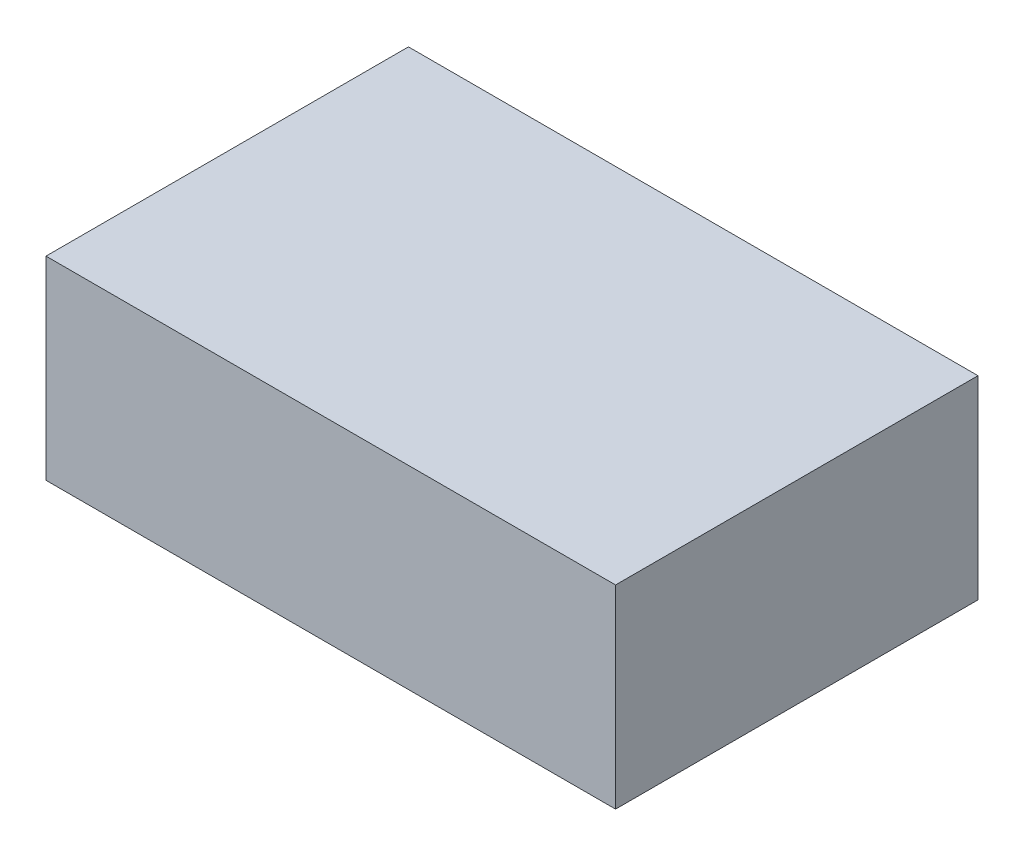
ISO-10303-21;
HEADER;
FILE_DESCRIPTION(('STEP AP214'),'2;1');
FILE_NAME('part.step','',(''),(''),'','','');
FILE_SCHEMA(('AUTOMOTIVE_DESIGN { 1 0 10303 214 1 1 1 1 }'));
ENDSEC;
DATA;
#1=APPLICATION_CONTEXT('core data for automotive mechanical design processes');
#2=APPLICATION_PROTOCOL_DEFINITION('international standard','automotive_design',2000,#1);
#3=PRODUCT_CONTEXT('',#1,'mechanical');
#4=PRODUCT('Part','Part','',(#3));
#5=PRODUCT_RELATED_PRODUCT_CATEGORY('part','',(#4));
#6=PRODUCT_DEFINITION_FORMATION('','',#4);
#7=PRODUCT_DEFINITION_CONTEXT('part definition',#1,'design');
#8=PRODUCT_DEFINITION('design','',#6,#7);
#9=PRODUCT_DEFINITION_SHAPE('','',#8);
#10=(LENGTH_UNIT() NAMED_UNIT(*) SI_UNIT(.MILLI.,.METRE.));
#11=(NAMED_UNIT(*) PLANE_ANGLE_UNIT() SI_UNIT($,.RADIAN.));
#12=(NAMED_UNIT(*) SI_UNIT($,.STERADIAN.) SOLID_ANGLE_UNIT());
#13=UNCERTAINTY_MEASURE_WITH_UNIT(LENGTH_MEASURE(1.E-05),#10,'distance_accuracy_value','');
#14=(GEOMETRIC_REPRESENTATION_CONTEXT(3) GLOBAL_UNCERTAINTY_ASSIGNED_CONTEXT((#13)) GLOBAL_UNIT_ASSIGNED_CONTEXT((#10,
#11,#12)) REPRESENTATION_CONTEXT('',''));
#15=CARTESIAN_POINT('',(0.,0.,0.));
#16=DIRECTION('',(0.,0.,1.));
#17=DIRECTION('',(1.,0.,0.));
#18=AXIS2_PLACEMENT_3D('',#15,#16,#17);
#19=CARTESIAN_POINT('',(-2.20000068,-0.7499985,0.));
#20=DIRECTION('',(0.,1.,0.));
#21=DIRECTION('',(0.,0.,1.));
#22=AXIS2_PLACEMENT_3D('',#19,#20,#21);
#23=PLANE('',#22);
#24=DIRECTION('',(-1.,0.,0.));
#25=VECTOR('',#24,1.);
#26=CARTESIAN_POINT('',(2.20000068,-0.7499985,0.));
#27=LINE('',#26,#25);
#28=CARTESIAN_POINT('',(2.20000068,-0.7499985,0.));
#29=VERTEX_POINT('',#28);
#30=CARTESIAN_POINT('',(-2.20000068,-0.7499985,0.));
#31=VERTEX_POINT('',#30);
#32=EDGE_CURVE('E53',#29,#31,#27,.T.);
#33=ORIENTED_EDGE('',*,*,#32,.F.);
#34=DIRECTION('',(0.,0.,1.));
#35=VECTOR('',#34,1.);
#36=CARTESIAN_POINT('',(2.20000068,-0.7499985,0.));
#37=LINE('',#36,#35);
#38=CARTESIAN_POINT('',(2.20000068,-0.7499985,2.8));
#39=VERTEX_POINT('',#38);
#40=EDGE_CURVE('E61',#29,#39,#37,.T.);
#41=ORIENTED_EDGE('',*,*,#40,.T.);
#42=DIRECTION('',(-1.,0.,0.));
#43=VECTOR('',#42,1.);
#44=CARTESIAN_POINT('',(2.20000068,-0.7499985,2.8));
#45=LINE('',#44,#43);
#46=CARTESIAN_POINT('',(-2.20000068,-0.7499985,2.8));
#47=VERTEX_POINT('',#46);
#48=EDGE_CURVE('E20',#39,#47,#45,.T.);
#49=ORIENTED_EDGE('',*,*,#48,.T.);
#50=DIRECTION('',(0.,0.,-1.));
#51=VECTOR('',#50,1.);
#52=CARTESIAN_POINT('',(-2.20000068,-0.7499985,0.));
#53=LINE('',#52,#51);
#54=EDGE_CURVE('E59',#47,#31,#53,.T.);
#55=ORIENTED_EDGE('',*,*,#54,.T.);
#56=EDGE_LOOP('',(#33,#41,#49,#55));
#57=FACE_BOUND('',#56,.T.);
#58=ADVANCED_FACE('F17',(#57),#23,.F.);
#59=CARTESIAN_POINT('',(2.20000068,0.75000104,2.8));
#60=DIRECTION('',(0.,0.,-1.));
#61=DIRECTION('',(-1.,0.,0.));
#62=AXIS2_PLACEMENT_3D('',#59,#60,#61);
#63=PLANE('',#62);
#64=DIRECTION('',(0.,1.,0.));
#65=VECTOR('',#64,1.);
#66=CARTESIAN_POINT('',(-2.20000068,0.75000104,2.8));
#67=LINE('',#66,#65);
#68=CARTESIAN_POINT('',(-2.20000068,0.75000104,2.8));
#69=VERTEX_POINT('',#68);
#70=EDGE_CURVE('E66',#69,#47,#67,.F.);
#71=ORIENTED_EDGE('',*,*,#70,.T.);
#72=ORIENTED_EDGE('',*,*,#48,.F.);
#73=DIRECTION('',(0.,1.,0.));
#74=VECTOR('',#73,1.);
#75=CARTESIAN_POINT('',(2.20000068,-0.7499985,2.8));
#76=LINE('',#75,#74);
#77=CARTESIAN_POINT('',(2.20000068,0.75000104,2.8));
#78=VERTEX_POINT('',#77);
#79=EDGE_CURVE('E79',#39,#78,#76,.T.);
#80=ORIENTED_EDGE('',*,*,#79,.T.);
#81=DIRECTION('',(1.,0.,0.));
#82=VECTOR('',#81,1.);
#83=CARTESIAN_POINT('',(2.20000068,0.75000104,2.8));
#84=LINE('',#83,#82);
#85=EDGE_CURVE('E75',#78,#69,#84,.F.);
#86=ORIENTED_EDGE('',*,*,#85,.T.);
#87=EDGE_LOOP('',(#71,#72,#80,#86));
#88=FACE_BOUND('',#87,.T.);
#89=ADVANCED_FACE('F74',(#88),#63,.F.);
#90=CARTESIAN_POINT('',(-2.20000068,0.75000104,0.));
#91=DIRECTION('',(1.,0.,0.));
#92=DIRECTION('',(0.,0.,-1.));
#93=AXIS2_PLACEMENT_3D('',#90,#91,#92);
#94=PLANE('',#93);
#95=DIRECTION('',(0.,1.,0.));
#96=VECTOR('',#95,1.);
#97=CARTESIAN_POINT('',(-2.20000068,0.75000104,0.));
#98=LINE('',#97,#96);
#99=CARTESIAN_POINT('',(-2.20000068,0.75000104,0.));
#100=VERTEX_POINT('',#99);
#101=EDGE_CURVE('E71',#31,#100,#98,.T.);
#102=ORIENTED_EDGE('',*,*,#101,.F.);
#103=ORIENTED_EDGE('',*,*,#54,.F.);
#104=ORIENTED_EDGE('',*,*,#70,.F.);
#105=DIRECTION('',(0.,0.,-1.));
#106=VECTOR('',#105,1.);
#107=CARTESIAN_POINT('',(-2.20000068,0.75000104,0.));
#108=LINE('',#107,#106);
#109=EDGE_CURVE('E84',#69,#100,#108,.T.);
#110=ORIENTED_EDGE('',*,*,#109,.T.);
#111=EDGE_LOOP('',(#102,#103,#104,#110));
#112=FACE_BOUND('',#111,.T.);
#113=ADVANCED_FACE('F68',(#112),#94,.F.);
#114=CARTESIAN_POINT('',(2.20000068,0.75000104,0.));
#115=DIRECTION('',(0.,0.,-1.));
#116=DIRECTION('',(-1.,0.,0.));
#117=AXIS2_PLACEMENT_3D('',#114,#115,#116);
#118=PLANE('',#117);
#119=ORIENTED_EDGE('',*,*,#32,.T.);
#120=ORIENTED_EDGE('',*,*,#101,.T.);
#121=DIRECTION('',(1.,0.,0.));
#122=VECTOR('',#121,1.);
#123=CARTESIAN_POINT('',(2.20000068,0.75000104,0.));
#124=LINE('',#123,#122);
#125=CARTESIAN_POINT('',(2.20000068,0.75000104,0.));
#126=VERTEX_POINT('',#125);
#127=EDGE_CURVE('E26',#100,#126,#124,.T.);
#128=ORIENTED_EDGE('',*,*,#127,.T.);
#129=DIRECTION('',(0.,1.,0.));
#130=VECTOR('',#129,1.);
#131=CARTESIAN_POINT('',(2.20000068,-0.7499985,0.));
#132=LINE('',#131,#130);
#133=EDGE_CURVE('E34',#126,#29,#132,.F.);
#134=ORIENTED_EDGE('',*,*,#133,.T.);
#135=EDGE_LOOP('',(#119,#120,#128,#134));
#136=FACE_BOUND('',#135,.T.);
#137=ADVANCED_FACE('F88',(#136),#118,.T.);
#138=CARTESIAN_POINT('',(2.20000068,-0.7499985,0.));
#139=DIRECTION('',(-1.,0.,0.));
#140=DIRECTION('',(0.,0.,1.));
#141=AXIS2_PLACEMENT_3D('',#138,#139,#140);
#142=PLANE('',#141);
#143=ORIENTED_EDGE('',*,*,#133,.F.);
#144=DIRECTION('',(0.,0.,-1.));
#145=VECTOR('',#144,1.);
#146=CARTESIAN_POINT('',(2.20000068,0.75000104,0.));
#147=LINE('',#146,#145);
#148=EDGE_CURVE('E11',#126,#78,#147,.F.);
#149=ORIENTED_EDGE('',*,*,#148,.T.);
#150=ORIENTED_EDGE('',*,*,#79,.F.);
#151=ORIENTED_EDGE('',*,*,#40,.F.);
#152=EDGE_LOOP('',(#143,#149,#150,#151));
#153=FACE_BOUND('',#152,.T.);
#154=ADVANCED_FACE('F91',(#153),#142,.F.);
#155=CARTESIAN_POINT('',(2.20000068,0.75000104,0.));
#156=DIRECTION('',(0.,-1.,0.));
#157=DIRECTION('',(0.,0.,-1.));
#158=AXIS2_PLACEMENT_3D('',#155,#156,#157);
#159=PLANE('',#158);
#160=ORIENTED_EDGE('',*,*,#127,.F.);
#161=ORIENTED_EDGE('',*,*,#109,.F.);
#162=ORIENTED_EDGE('',*,*,#85,.F.);
#163=ORIENTED_EDGE('',*,*,#148,.F.);
#164=EDGE_LOOP('',(#160,#161,#162,#163));
#165=FACE_BOUND('',#164,.T.);
#166=ADVANCED_FACE('F90',(#165),#159,.F.);
#167=CLOSED_SHELL('',(#58,#89,#113,#137,#154,#166));
#168=MANIFOLD_SOLID_BREP('B1',#167);
#169=ADVANCED_BREP_SHAPE_REPRESENTATION('',(#18,#168),#14);
#170=SHAPE_DEFINITION_REPRESENTATION(#9,#169);
ENDSEC;
END-ISO-10303-21;
